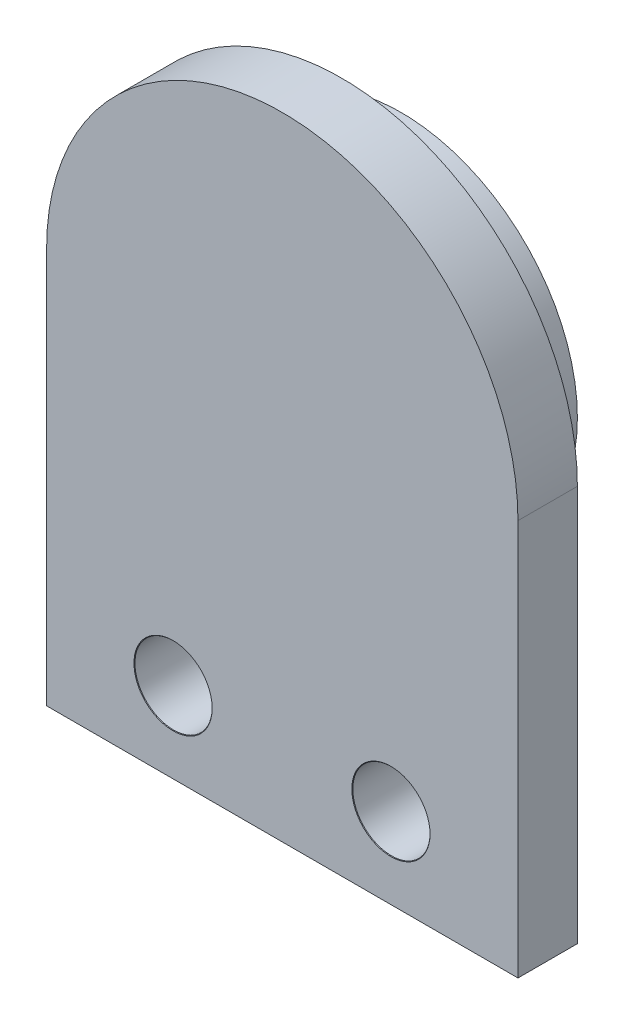
ISO-10303-21;
HEADER;
FILE_DESCRIPTION(('STEP AP214'),'2;1');
FILE_NAME('part.step','',(''),(''),'','','');
FILE_SCHEMA(('AUTOMOTIVE_DESIGN { 1 0 10303 214 1 1 1 1 }'));
ENDSEC;
DATA;
#1=APPLICATION_CONTEXT('core data for automotive mechanical design processes');
#2=APPLICATION_PROTOCOL_DEFINITION('international standard','automotive_design',2000,#1);
#3=PRODUCT_CONTEXT('',#1,'mechanical');
#4=PRODUCT('Part','Part','',(#3));
#5=PRODUCT_RELATED_PRODUCT_CATEGORY('part','',(#4));
#6=PRODUCT_DEFINITION_FORMATION('','',#4);
#7=PRODUCT_DEFINITION_CONTEXT('part definition',#1,'design');
#8=PRODUCT_DEFINITION('design','',#6,#7);
#9=PRODUCT_DEFINITION_SHAPE('','',#8);
#10=(LENGTH_UNIT() NAMED_UNIT(*) SI_UNIT(.MILLI.,.METRE.));
#11=(NAMED_UNIT(*) PLANE_ANGLE_UNIT() SI_UNIT($,.RADIAN.));
#12=(NAMED_UNIT(*) SI_UNIT($,.STERADIAN.) SOLID_ANGLE_UNIT());
#13=UNCERTAINTY_MEASURE_WITH_UNIT(LENGTH_MEASURE(1.E-05),#10,'distance_accuracy_value','');
#14=(GEOMETRIC_REPRESENTATION_CONTEXT(3) GLOBAL_UNCERTAINTY_ASSIGNED_CONTEXT((#13)) GLOBAL_UNIT_ASSIGNED_CONTEXT((#10,
#11,#12)) REPRESENTATION_CONTEXT('',''));
#15=CARTESIAN_POINT('',(0.,0.,0.));
#16=DIRECTION('',(0.,0.,1.));
#17=DIRECTION('',(1.,0.,0.));
#18=AXIS2_PLACEMENT_3D('',#15,#16,#17);
#19=CARTESIAN_POINT('',(0.,0.,3.));
#20=DIRECTION('',(0.,0.,-1.));
#21=DIRECTION('',(-1.,0.,0.));
#22=AXIS2_PLACEMENT_3D('',#19,#20,#21);
#23=CYLINDRICAL_SURFACE('',#22,11.9);
#24=CARTESIAN_POINT('',(0.,0.,0.));
#25=DIRECTION('',(0.,0.,1.));
#26=DIRECTION('',(1.,0.,0.));
#27=AXIS2_PLACEMENT_3D('',#24,#25,#26);
#28=CIRCLE('',#27,11.9);
#29=CARTESIAN_POINT('',(11.9,0.,0.));
#30=VERTEX_POINT('',#29);
#31=CARTESIAN_POINT('',(-11.9,0.,0.));
#32=VERTEX_POINT('',#31);
#33=EDGE_CURVE('E105',#30,#32,#28,.T.);
#34=ORIENTED_EDGE('',*,*,#33,.T.);
#35=DIRECTION('',(0.,0.,-1.));
#36=VECTOR('',#35,1.);
#37=CARTESIAN_POINT('',(-11.9,0.,3.));
#38=LINE('',#37,#36);
#39=CARTESIAN_POINT('',(-11.9,0.,3.));
#40=VERTEX_POINT('',#39);
#41=EDGE_CURVE('E96',#40,#32,#38,.T.);
#42=ORIENTED_EDGE('',*,*,#41,.F.);
#43=CARTESIAN_POINT('',(0.,0.,3.));
#44=DIRECTION('',(0.,0.,1.));
#45=DIRECTION('',(1.,0.,0.));
#46=AXIS2_PLACEMENT_3D('',#43,#44,#45);
#47=CIRCLE('',#46,11.9);
#48=CARTESIAN_POINT('',(11.9,0.,3.));
#49=VERTEX_POINT('',#48);
#50=EDGE_CURVE('E90',#49,#40,#47,.T.);
#51=ORIENTED_EDGE('',*,*,#50,.F.);
#52=DIRECTION('',(0.,0.,-1.));
#53=VECTOR('',#52,1.);
#54=CARTESIAN_POINT('',(11.9,0.,3.));
#55=LINE('',#54,#53);
#56=EDGE_CURVE('E101',#49,#30,#55,.T.);
#57=ORIENTED_EDGE('',*,*,#56,.T.);
#58=EDGE_LOOP('',(#34,#42,#51,#57));
#59=FACE_BOUND('',#58,.T.);
#60=ADVANCED_FACE('F36',(#59),#23,.T.);
#61=CARTESIAN_POINT('',(-11.9,0.,3.));
#62=DIRECTION('',(1.,0.,0.));
#63=DIRECTION('',(0.,0.,-1.));
#64=AXIS2_PLACEMENT_3D('',#61,#62,#63);
#65=PLANE('',#64);
#66=DIRECTION('',(0.,-1.,0.));
#67=VECTOR('',#66,1.);
#68=CARTESIAN_POINT('',(-11.9,0.,0.));
#69=LINE('',#68,#67);
#70=CARTESIAN_POINT('',(-11.9,-20.,0.));
#71=VERTEX_POINT('',#70);
#72=EDGE_CURVE('E95',#32,#71,#69,.T.);
#73=ORIENTED_EDGE('',*,*,#72,.T.);
#74=DIRECTION('',(0.,0.,-1.));
#75=VECTOR('',#74,1.);
#76=CARTESIAN_POINT('',(-11.9,-20.,3.));
#77=LINE('',#76,#75);
#78=CARTESIAN_POINT('',(-11.9,-20.,3.));
#79=VERTEX_POINT('',#78);
#80=EDGE_CURVE('E93',#79,#71,#77,.T.);
#81=ORIENTED_EDGE('',*,*,#80,.F.);
#82=DIRECTION('',(0.,-1.,0.));
#83=VECTOR('',#82,1.);
#84=CARTESIAN_POINT('',(-11.9,0.,3.));
#85=LINE('',#84,#83);
#86=EDGE_CURVE('E85',#40,#79,#85,.T.);
#87=ORIENTED_EDGE('',*,*,#86,.F.);
#88=ORIENTED_EDGE('',*,*,#41,.T.);
#89=EDGE_LOOP('',(#73,#81,#87,#88));
#90=FACE_BOUND('',#89,.T.);
#91=ADVANCED_FACE('F94',(#90),#65,.F.);
#92=CARTESIAN_POINT('',(-11.9,-20.,3.));
#93=DIRECTION('',(0.,1.,0.));
#94=DIRECTION('',(0.,0.,1.));
#95=AXIS2_PLACEMENT_3D('',#92,#93,#94);
#96=PLANE('',#95);
#97=DIRECTION('',(1.,0.,0.));
#98=VECTOR('',#97,1.);
#99=CARTESIAN_POINT('',(-11.9,-20.,0.));
#100=LINE('',#99,#98);
#101=CARTESIAN_POINT('',(11.9,-20.,0.));
#102=VERTEX_POINT('',#101);
#103=EDGE_CURVE('E71',#71,#102,#100,.T.);
#104=ORIENTED_EDGE('',*,*,#103,.T.);
#105=DIRECTION('',(0.,0.,-1.));
#106=VECTOR('',#105,1.);
#107=CARTESIAN_POINT('',(11.9,-20.,3.));
#108=LINE('',#107,#106);
#109=CARTESIAN_POINT('',(11.9,-20.,3.));
#110=VERTEX_POINT('',#109);
#111=EDGE_CURVE('E97',#110,#102,#108,.T.);
#112=ORIENTED_EDGE('',*,*,#111,.F.);
#113=DIRECTION('',(1.,0.,0.));
#114=VECTOR('',#113,1.);
#115=CARTESIAN_POINT('',(-11.9,-20.,3.));
#116=LINE('',#115,#114);
#117=EDGE_CURVE('E88',#79,#110,#116,.T.);
#118=ORIENTED_EDGE('',*,*,#117,.F.);
#119=ORIENTED_EDGE('',*,*,#80,.T.);
#120=EDGE_LOOP('',(#104,#112,#118,#119));
#121=FACE_BOUND('',#120,.T.);
#122=ADVANCED_FACE('F99',(#121),#96,.F.);
#123=CARTESIAN_POINT('',(11.9,-20.,3.));
#124=DIRECTION('',(-1.,0.,0.));
#125=DIRECTION('',(0.,0.,1.));
#126=AXIS2_PLACEMENT_3D('',#123,#124,#125);
#127=PLANE('',#126);
#128=DIRECTION('',(0.,1.,0.));
#129=VECTOR('',#128,1.);
#130=CARTESIAN_POINT('',(11.9,-20.,0.));
#131=LINE('',#130,#129);
#132=EDGE_CURVE('E77',#102,#30,#131,.T.);
#133=ORIENTED_EDGE('',*,*,#132,.T.);
#134=ORIENTED_EDGE('',*,*,#56,.F.);
#135=DIRECTION('',(0.,1.,0.));
#136=VECTOR('',#135,1.);
#137=CARTESIAN_POINT('',(11.9,-20.,3.));
#138=LINE('',#137,#136);
#139=EDGE_CURVE('E54',#110,#49,#138,.T.);
#140=ORIENTED_EDGE('',*,*,#139,.F.);
#141=ORIENTED_EDGE('',*,*,#111,.T.);
#142=EDGE_LOOP('',(#133,#134,#140,#141));
#143=FACE_BOUND('',#142,.T.);
#144=ADVANCED_FACE('F145',(#143),#127,.F.);
#145=CARTESIAN_POINT('',(0.,0.,3.));
#146=DIRECTION('',(0.,0.,1.));
#147=DIRECTION('',(1.,0.,0.));
#148=AXIS2_PLACEMENT_3D('',#145,#146,#147);
#149=PLANE('',#148);
#150=CARTESIAN_POINT('',(-5.51515643309785,-15.9262012197425,3.));
#151=DIRECTION('',(0.,0.,1.));
#152=DIRECTION('',(1.,0.,0.));
#153=AXIS2_PLACEMENT_3D('',#150,#151,#152);
#154=CIRCLE('',#153,1.975);
#155=CARTESIAN_POINT('',(-3.54015643309785,-15.9262012197425,3.));
#156=VERTEX_POINT('',#155);
#157=EDGE_CURVE('E303',#156,#156,#154,.T.);
#158=ORIENTED_EDGE('',*,*,#157,.F.);
#159=EDGE_LOOP('',(#158));
#160=FACE_BOUND('',#159,.T.);
#161=CARTESIAN_POINT('',(5.48484356690216,-15.9262012197425,3.));
#162=DIRECTION('',(0.,0.,1.));
#163=DIRECTION('',(1.,0.,0.));
#164=AXIS2_PLACEMENT_3D('',#161,#162,#163);
#165=CIRCLE('',#164,1.975);
#166=CARTESIAN_POINT('',(7.45984356690216,-15.9262012197425,3.));
#167=VERTEX_POINT('',#166);
#168=EDGE_CURVE('E123',#167,#167,#165,.T.);
#169=ORIENTED_EDGE('',*,*,#168,.F.);
#170=EDGE_LOOP('',(#169));
#171=FACE_BOUND('',#170,.T.);
#172=ORIENTED_EDGE('',*,*,#50,.T.);
#173=ORIENTED_EDGE('',*,*,#86,.T.);
#174=ORIENTED_EDGE('',*,*,#117,.T.);
#175=ORIENTED_EDGE('',*,*,#139,.T.);
#176=EDGE_LOOP('',(#172,#173,#174,#175));
#177=FACE_BOUND('',#176,.T.);
#178=ADVANCED_FACE('F86',(#160,#171,#177),#149,.T.);
#179=CARTESIAN_POINT('',(0.,0.,0.));
#180=DIRECTION('',(0.,0.,1.));
#181=DIRECTION('',(1.,0.,0.));
#182=AXIS2_PLACEMENT_3D('',#179,#180,#181);
#183=PLANE('',#182);
#184=CARTESIAN_POINT('',(-5.51515643309785,-15.9262012197425,0.));
#185=DIRECTION('',(0.,0.,1.));
#186=DIRECTION('',(1.,0.,0.));
#187=AXIS2_PLACEMENT_3D('',#184,#185,#186);
#188=CIRCLE('',#187,1.95);
#189=CARTESIAN_POINT('',(-3.56515643309785,-15.9262012197425,0.));
#190=VERTEX_POINT('',#189);
#191=EDGE_CURVE('E39',#190,#190,#188,.T.);
#192=ORIENTED_EDGE('',*,*,#191,.T.);
#193=EDGE_LOOP('',(#192));
#194=FACE_BOUND('',#193,.T.);
#195=CARTESIAN_POINT('',(5.48484356690216,-15.9262012197425,0.));
#196=DIRECTION('',(0.,0.,1.));
#197=DIRECTION('',(1.,0.,0.));
#198=AXIS2_PLACEMENT_3D('',#195,#196,#197);
#199=CIRCLE('',#198,1.95);
#200=CARTESIAN_POINT('',(7.43484356690216,-15.9262012197425,0.));
#201=VERTEX_POINT('',#200);
#202=EDGE_CURVE('E114',#201,#201,#199,.T.);
#203=ORIENTED_EDGE('',*,*,#202,.T.);
#204=EDGE_LOOP('',(#203));
#205=FACE_BOUND('',#204,.T.);
#206=CARTESIAN_POINT('',(0.,0.,0.));
#207=DIRECTION('',(0.,0.,-1.));
#208=DIRECTION('',(-1.,0.,0.));
#209=AXIS2_PLACEMENT_3D('',#206,#207,#208);
#210=CIRCLE('',#209,8.9);
#211=CARTESIAN_POINT('',(-8.9,0.,0.));
#212=VERTEX_POINT('',#211);
#213=EDGE_CURVE('E45',#212,#212,#210,.T.);
#214=ORIENTED_EDGE('',*,*,#213,.F.);
#215=EDGE_LOOP('',(#214));
#216=FACE_BOUND('',#215,.T.);
#217=ORIENTED_EDGE('',*,*,#33,.F.);
#218=ORIENTED_EDGE('',*,*,#132,.F.);
#219=ORIENTED_EDGE('',*,*,#103,.F.);
#220=ORIENTED_EDGE('',*,*,#72,.F.);
#221=EDGE_LOOP('',(#217,#218,#219,#220));
#222=FACE_BOUND('',#221,.T.);
#223=ADVANCED_FACE('F138',(#194,#205,#216,#222),#183,.F.);
#224=CARTESIAN_POINT('',(0.,0.,-3.));
#225=DIRECTION('',(0.,0.,1.));
#226=DIRECTION('',(1.,0.,0.));
#227=AXIS2_PLACEMENT_3D('',#224,#225,#226);
#228=CYLINDRICAL_SURFACE('',#227,8.9);
#229=CARTESIAN_POINT('',(0.,0.,-3.));
#230=DIRECTION('',(0.,0.,-1.));
#231=DIRECTION('',(-1.,0.,0.));
#232=AXIS2_PLACEMENT_3D('',#229,#230,#231);
#233=CIRCLE('',#232,8.9);
#234=CARTESIAN_POINT('',(-8.9,0.,-3.));
#235=VERTEX_POINT('',#234);
#236=EDGE_CURVE('E108',#235,#235,#233,.T.);
#237=ORIENTED_EDGE('',*,*,#236,.F.);
#238=EDGE_LOOP('',(#237));
#239=FACE_BOUND('',#238,.T.);
#240=ORIENTED_EDGE('',*,*,#213,.T.);
#241=EDGE_LOOP('',(#240));
#242=FACE_BOUND('',#241,.T.);
#243=ADVANCED_FACE('F136',(#239,#242),#228,.T.);
#244=CARTESIAN_POINT('',(0.,0.,-3.));
#245=DIRECTION('',(0.,0.,-1.));
#246=DIRECTION('',(-1.,0.,0.));
#247=AXIS2_PLACEMENT_3D('',#244,#245,#246);
#248=PLANE('',#247);
#249=CARTESIAN_POINT('',(0.,0.,-3.));
#250=DIRECTION('',(0.,0.,-1.));
#251=DIRECTION('',(-1.,0.,0.));
#252=AXIS2_PLACEMENT_3D('',#249,#250,#251);
#253=CIRCLE('',#252,2.);
#254=CARTESIAN_POINT('',(-2.,0.,-3.));
#255=VERTEX_POINT('',#254);
#256=EDGE_CURVE('E11',#255,#255,#253,.T.);
#257=ORIENTED_EDGE('',*,*,#256,.F.);
#258=EDGE_LOOP('',(#257));
#259=FACE_BOUND('',#258,.T.);
#260=ORIENTED_EDGE('',*,*,#236,.T.);
#261=EDGE_LOOP('',(#260));
#262=FACE_BOUND('',#261,.T.);
#263=ADVANCED_FACE('F182',(#259,#262),#248,.T.);
#264=CARTESIAN_POINT('',(0.,0.,-6.));
#265=DIRECTION('',(0.,0.,1.));
#266=DIRECTION('',(1.,0.,0.));
#267=AXIS2_PLACEMENT_3D('',#264,#265,#266);
#268=CYLINDRICAL_SURFACE('',#267,2.);
#269=CARTESIAN_POINT('',(0.,0.,-6.));
#270=DIRECTION('',(0.,0.,-1.));
#271=DIRECTION('',(-1.,0.,0.));
#272=AXIS2_PLACEMENT_3D('',#269,#270,#271);
#273=CIRCLE('',#272,2.);
#274=CARTESIAN_POINT('',(-2.,0.,-6.));
#275=VERTEX_POINT('',#274);
#276=EDGE_CURVE('E116',#275,#275,#273,.T.);
#277=ORIENTED_EDGE('',*,*,#276,.F.);
#278=EDGE_LOOP('',(#277));
#279=FACE_BOUND('',#278,.T.);
#280=ORIENTED_EDGE('',*,*,#256,.T.);
#281=EDGE_LOOP('',(#280));
#282=FACE_BOUND('',#281,.T.);
#283=ADVANCED_FACE('F195',(#279,#282),#268,.T.);
#284=CARTESIAN_POINT('',(0.,0.,-6.));
#285=DIRECTION('',(0.,0.,-1.));
#286=DIRECTION('',(-1.,0.,0.));
#287=AXIS2_PLACEMENT_3D('',#284,#285,#286);
#288=PLANE('',#287);
#289=ORIENTED_EDGE('',*,*,#276,.T.);
#290=EDGE_LOOP('',(#289));
#291=FACE_BOUND('',#290,.T.);
#292=ADVANCED_FACE('F206',(#291),#288,.T.);
#293=CARTESIAN_POINT('',(5.48484356690216,-15.9262012197425,3.));
#294=DIRECTION('',(0.,0.,1.));
#295=DIRECTION('',(1.,0.,0.));
#296=AXIS2_PLACEMENT_3D('',#293,#294,#295);
#297=CYLINDRICAL_SURFACE('',#296,1.95);
#298=CARTESIAN_POINT('',(5.48484356690216,-15.9262012197425,2.975));
#299=DIRECTION('',(0.,0.,1.));
#300=DIRECTION('',(1.,0.,0.));
#301=AXIS2_PLACEMENT_3D('',#298,#299,#300);
#302=CIRCLE('',#301,1.95);
#303=CARTESIAN_POINT('',(7.43484356690216,-15.9262012197425,2.975));
#304=VERTEX_POINT('',#303);
#305=EDGE_CURVE('E117',#304,#304,#302,.T.);
#306=ORIENTED_EDGE('',*,*,#305,.T.);
#307=EDGE_LOOP('',(#306));
#308=FACE_BOUND('',#307,.T.);
#309=ORIENTED_EDGE('',*,*,#202,.F.);
#310=EDGE_LOOP('',(#309));
#311=FACE_BOUND('',#310,.T.);
#312=ADVANCED_FACE('F216',(#308,#311),#297,.F.);
#313=CARTESIAN_POINT('',(5.48484356690216,-15.9262012197425,3.));
#314=DIRECTION('',(0.,0.,1.));
#315=DIRECTION('',(1.,0.,0.));
#316=AXIS2_PLACEMENT_3D('',#313,#314,#315);
#317=CONICAL_SURFACE('',#316,1.975,0.785398163397466);
#318=ORIENTED_EDGE('',*,*,#305,.F.);
#319=EDGE_LOOP('',(#318));
#320=FACE_BOUND('',#319,.T.);
#321=ORIENTED_EDGE('',*,*,#168,.T.);
#322=EDGE_LOOP('',(#321));
#323=FACE_BOUND('',#322,.T.);
#324=ADVANCED_FACE('F232',(#320,#323),#317,.F.);
#325=CARTESIAN_POINT('',(-5.51515643309785,-15.9262012197425,3.));
#326=DIRECTION('',(0.,0.,1.));
#327=DIRECTION('',(1.,0.,0.));
#328=AXIS2_PLACEMENT_3D('',#325,#326,#327);
#329=CYLINDRICAL_SURFACE('',#328,1.95);
#330=CARTESIAN_POINT('',(-5.51515643309785,-15.9262012197425,2.975));
#331=DIRECTION('',(0.,0.,1.));
#332=DIRECTION('',(1.,0.,0.));
#333=AXIS2_PLACEMENT_3D('',#330,#331,#332);
#334=CIRCLE('',#333,1.95);
#335=CARTESIAN_POINT('',(-3.56515643309785,-15.9262012197425,2.975));
#336=VERTEX_POINT('',#335);
#337=EDGE_CURVE('E300',#336,#336,#334,.T.);
#338=ORIENTED_EDGE('',*,*,#337,.T.);
#339=EDGE_LOOP('',(#338));
#340=FACE_BOUND('',#339,.T.);
#341=ORIENTED_EDGE('',*,*,#191,.F.);
#342=EDGE_LOOP('',(#341));
#343=FACE_BOUND('',#342,.T.);
#344=ADVANCED_FACE('F242',(#340,#343),#329,.F.);
#345=CARTESIAN_POINT('',(-5.51515643309785,-15.9262012197425,3.));
#346=DIRECTION('',(0.,0.,1.));
#347=DIRECTION('',(1.,0.,0.));
#348=AXIS2_PLACEMENT_3D('',#345,#346,#347);
#349=CONICAL_SURFACE('',#348,1.975,0.785398163397466);
#350=ORIENTED_EDGE('',*,*,#337,.F.);
#351=EDGE_LOOP('',(#350));
#352=FACE_BOUND('',#351,.T.);
#353=ORIENTED_EDGE('',*,*,#157,.T.);
#354=EDGE_LOOP('',(#353));
#355=FACE_BOUND('',#354,.T.);
#356=ADVANCED_FACE('F253',(#352,#355),#349,.F.);
#357=CLOSED_SHELL('',(#60,#91,#122,#144,#178,#223,#243,#263,#283,#292,#312,#324,#344,#356));
#358=MANIFOLD_SOLID_BREP('B2',#357);
#359=ADVANCED_BREP_SHAPE_REPRESENTATION('',(#18,#358),#14);
#360=SHAPE_DEFINITION_REPRESENTATION(#9,#359);
ENDSEC;
END-ISO-10303-21;
